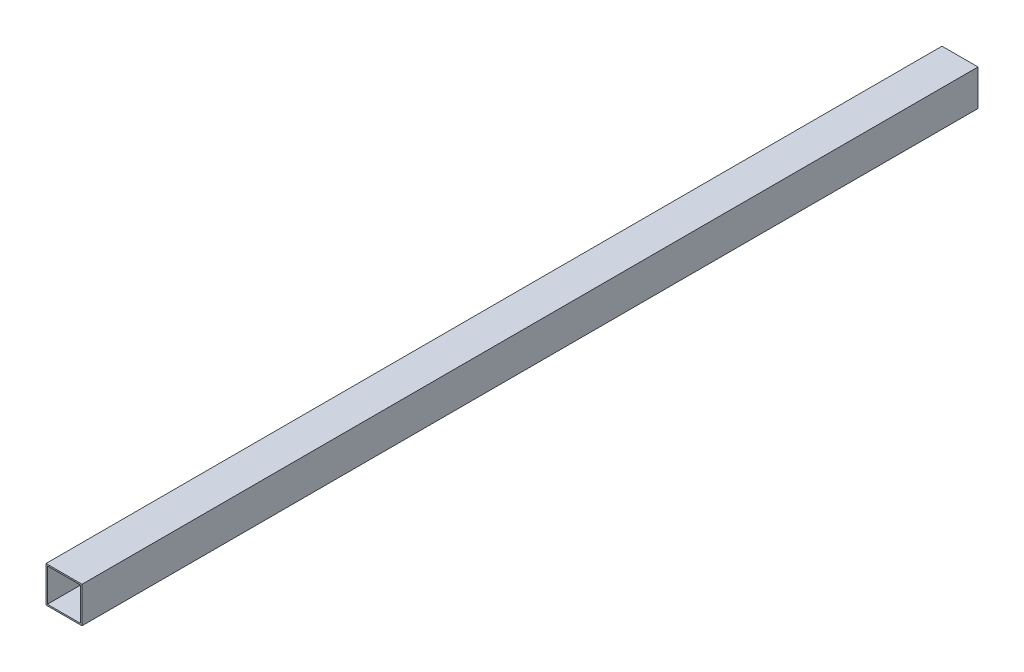
ISO-10303-21;
HEADER;
FILE_DESCRIPTION(('STEP AP214'),'2;1');
FILE_NAME('part.step','',(''),(''),'','','');
FILE_SCHEMA(('AUTOMOTIVE_DESIGN { 1 0 10303 214 1 1 1 1 }'));
ENDSEC;
DATA;
#1=APPLICATION_CONTEXT('core data for automotive mechanical design processes');
#2=APPLICATION_PROTOCOL_DEFINITION('international standard','automotive_design',2000,#1);
#3=PRODUCT_CONTEXT('',#1,'mechanical');
#4=PRODUCT('Part','Part','',(#3));
#5=PRODUCT_RELATED_PRODUCT_CATEGORY('part','',(#4));
#6=PRODUCT_DEFINITION_FORMATION('','',#4);
#7=PRODUCT_DEFINITION_CONTEXT('part definition',#1,'design');
#8=PRODUCT_DEFINITION('design','',#6,#7);
#9=PRODUCT_DEFINITION_SHAPE('','',#8);
#10=(LENGTH_UNIT() NAMED_UNIT(*) SI_UNIT(.MILLI.,.METRE.));
#11=(NAMED_UNIT(*) PLANE_ANGLE_UNIT() SI_UNIT($,.RADIAN.));
#12=(NAMED_UNIT(*) SI_UNIT($,.STERADIAN.) SOLID_ANGLE_UNIT());
#13=UNCERTAINTY_MEASURE_WITH_UNIT(LENGTH_MEASURE(1.E-05),#10,'distance_accuracy_value','');
#14=(GEOMETRIC_REPRESENTATION_CONTEXT(3) GLOBAL_UNCERTAINTY_ASSIGNED_CONTEXT((#13)) GLOBAL_UNIT_ASSIGNED_CONTEXT((#10,
#11,#12)) REPRESENTATION_CONTEXT('',''));
#15=CARTESIAN_POINT('',(0.,0.,0.));
#16=DIRECTION('',(0.,0.,1.));
#17=DIRECTION('',(1.,0.,0.));
#18=AXIS2_PLACEMENT_3D('',#15,#16,#17);
#19=CARTESIAN_POINT('',(0.,0.,323.5));
#20=DIRECTION('',(0.,0.,1.));
#21=DIRECTION('',(1.,0.,0.));
#22=AXIS2_PLACEMENT_3D('',#19,#20,#21);
#23=PLANE('',#22);
#24=DIRECTION('',(0.,1.,0.));
#25=VECTOR('',#24,1.);
#26=CARTESIAN_POINT('',(6.5,6.5,323.5));
#27=LINE('',#26,#25);
#28=CARTESIAN_POINT('',(6.5,-6.5,323.5));
#29=VERTEX_POINT('',#28);
#30=CARTESIAN_POINT('',(6.5,6.5,323.5));
#31=VERTEX_POINT('',#30);
#32=EDGE_CURVE('E133',#29,#31,#27,.T.);
#33=ORIENTED_EDGE('',*,*,#32,.T.);
#34=DIRECTION('',(-1.,0.,0.));
#35=VECTOR('',#34,1.);
#36=CARTESIAN_POINT('',(-6.5,6.5,323.5));
#37=LINE('',#36,#35);
#38=CARTESIAN_POINT('',(-6.5,6.5,323.5));
#39=VERTEX_POINT('',#38);
#40=EDGE_CURVE('E136',#31,#39,#37,.T.);
#41=ORIENTED_EDGE('',*,*,#40,.T.);
#42=DIRECTION('',(0.,-1.,0.));
#43=VECTOR('',#42,1.);
#44=CARTESIAN_POINT('',(-6.5,6.5,323.5));
#45=LINE('',#44,#43);
#46=CARTESIAN_POINT('',(-6.5,-6.5,323.5));
#47=VERTEX_POINT('',#46);
#48=EDGE_CURVE('E139',#39,#47,#45,.T.);
#49=ORIENTED_EDGE('',*,*,#48,.T.);
#50=DIRECTION('',(1.,0.,0.));
#51=VECTOR('',#50,1.);
#52=CARTESIAN_POINT('',(-6.5,-6.5,323.5));
#53=LINE('',#52,#51);
#54=EDGE_CURVE('E141',#47,#29,#53,.T.);
#55=ORIENTED_EDGE('',*,*,#54,.T.);
#56=EDGE_LOOP('',(#33,#41,#49,#55));
#57=FACE_BOUND('',#56,.T.);
#58=DIRECTION('',(1.,0.,0.));
#59=VECTOR('',#58,1.);
#60=CARTESIAN_POINT('',(6.,-6.,323.5));
#61=LINE('',#60,#59);
#62=CARTESIAN_POINT('',(-6.,-6.,323.5));
#63=VERTEX_POINT('',#62);
#64=CARTESIAN_POINT('',(6.,-6.,323.5));
#65=VERTEX_POINT('',#64);
#66=EDGE_CURVE('E105',#63,#65,#61,.T.);
#67=ORIENTED_EDGE('',*,*,#66,.F.);
#68=DIRECTION('',(0.,-1.,0.));
#69=VECTOR('',#68,1.);
#70=CARTESIAN_POINT('',(-6.,6.,323.5));
#71=LINE('',#70,#69);
#72=CARTESIAN_POINT('',(-6.,6.,323.5));
#73=VERTEX_POINT('',#72);
#74=EDGE_CURVE('E97',#73,#63,#71,.T.);
#75=ORIENTED_EDGE('',*,*,#74,.F.);
#76=DIRECTION('',(-1.,0.,0.));
#77=VECTOR('',#76,1.);
#78=CARTESIAN_POINT('',(6.,6.,323.5));
#79=LINE('',#78,#77);
#80=CARTESIAN_POINT('',(6.,6.,323.5));
#81=VERTEX_POINT('',#80);
#82=EDGE_CURVE('E119',#81,#73,#79,.T.);
#83=ORIENTED_EDGE('',*,*,#82,.F.);
#84=DIRECTION('',(0.,1.,0.));
#85=VECTOR('',#84,1.);
#86=CARTESIAN_POINT('',(6.,6.,323.5));
#87=LINE('',#86,#85);
#88=EDGE_CURVE('E117',#65,#81,#87,.T.);
#89=ORIENTED_EDGE('',*,*,#88,.F.);
#90=EDGE_LOOP('',(#67,#75,#83,#89));
#91=FACE_BOUND('',#90,.T.);
#92=ADVANCED_FACE('F32',(#57,#91),#23,.T.);
#93=CARTESIAN_POINT('',(0.,0.,0.));
#94=DIRECTION('',(0.,0.,1.));
#95=DIRECTION('',(1.,0.,0.));
#96=AXIS2_PLACEMENT_3D('',#93,#94,#95);
#97=PLANE('',#96);
#98=DIRECTION('',(0.,1.,0.));
#99=VECTOR('',#98,1.);
#100=CARTESIAN_POINT('',(6.5,6.5,0.));
#101=LINE('',#100,#99);
#102=CARTESIAN_POINT('',(6.5,-6.5,0.));
#103=VERTEX_POINT('',#102);
#104=CARTESIAN_POINT('',(6.5,6.5,0.));
#105=VERTEX_POINT('',#104);
#106=EDGE_CURVE('E113',#103,#105,#101,.T.);
#107=ORIENTED_EDGE('',*,*,#106,.F.);
#108=DIRECTION('',(1.,0.,0.));
#109=VECTOR('',#108,1.);
#110=CARTESIAN_POINT('',(-6.5,-6.5,0.));
#111=LINE('',#110,#109);
#112=CARTESIAN_POINT('',(-6.5,-6.5,0.));
#113=VERTEX_POINT('',#112);
#114=EDGE_CURVE('E137',#113,#103,#111,.T.);
#115=ORIENTED_EDGE('',*,*,#114,.F.);
#116=DIRECTION('',(0.,-1.,0.));
#117=VECTOR('',#116,1.);
#118=CARTESIAN_POINT('',(-6.5,6.5,0.));
#119=LINE('',#118,#117);
#120=CARTESIAN_POINT('',(-6.5,6.5,0.));
#121=VERTEX_POINT('',#120);
#122=EDGE_CURVE('E148',#121,#113,#119,.T.);
#123=ORIENTED_EDGE('',*,*,#122,.F.);
#124=DIRECTION('',(-1.,0.,0.));
#125=VECTOR('',#124,1.);
#126=CARTESIAN_POINT('',(-6.5,6.5,0.));
#127=LINE('',#126,#125);
#128=EDGE_CURVE('E146',#105,#121,#127,.T.);
#129=ORIENTED_EDGE('',*,*,#128,.F.);
#130=EDGE_LOOP('',(#107,#115,#123,#129));
#131=FACE_BOUND('',#130,.T.);
#132=DIRECTION('',(0.,-1.,0.));
#133=VECTOR('',#132,1.);
#134=CARTESIAN_POINT('',(-6.,6.,0.));
#135=LINE('',#134,#133);
#136=CARTESIAN_POINT('',(-6.,6.,0.));
#137=VERTEX_POINT('',#136);
#138=CARTESIAN_POINT('',(-6.,-6.,0.));
#139=VERTEX_POINT('',#138);
#140=EDGE_CURVE('E55',#137,#139,#135,.T.);
#141=ORIENTED_EDGE('',*,*,#140,.T.);
#142=DIRECTION('',(1.,0.,0.));
#143=VECTOR('',#142,1.);
#144=CARTESIAN_POINT('',(6.,-6.,0.));
#145=LINE('',#144,#143);
#146=CARTESIAN_POINT('',(6.,-6.,0.));
#147=VERTEX_POINT('',#146);
#148=EDGE_CURVE('E112',#139,#147,#145,.T.);
#149=ORIENTED_EDGE('',*,*,#148,.T.);
#150=DIRECTION('',(0.,1.,0.));
#151=VECTOR('',#150,1.);
#152=CARTESIAN_POINT('',(6.,6.,0.));
#153=LINE('',#152,#151);
#154=CARTESIAN_POINT('',(6.,6.,0.));
#155=VERTEX_POINT('',#154);
#156=EDGE_CURVE('E125',#147,#155,#153,.T.);
#157=ORIENTED_EDGE('',*,*,#156,.T.);
#158=DIRECTION('',(-1.,0.,0.));
#159=VECTOR('',#158,1.);
#160=CARTESIAN_POINT('',(6.,6.,0.));
#161=LINE('',#160,#159);
#162=EDGE_CURVE('E106',#155,#137,#161,.T.);
#163=ORIENTED_EDGE('',*,*,#162,.T.);
#164=EDGE_LOOP('',(#141,#149,#157,#163));
#165=FACE_BOUND('',#164,.T.);
#166=ADVANCED_FACE('F166',(#131,#165),#97,.F.);
#167=CARTESIAN_POINT('',(6.5,6.5,323.5));
#168=DIRECTION('',(-1.,0.,0.));
#169=DIRECTION('',(0.,0.,1.));
#170=AXIS2_PLACEMENT_3D('',#167,#168,#169);
#171=PLANE('',#170);
#172=ORIENTED_EDGE('',*,*,#106,.T.);
#173=DIRECTION('',(0.,0.,-1.));
#174=VECTOR('',#173,1.);
#175=CARTESIAN_POINT('',(6.5,6.5,323.5));
#176=LINE('',#175,#174);
#177=EDGE_CURVE('E11',#31,#105,#176,.T.);
#178=ORIENTED_EDGE('',*,*,#177,.F.);
#179=ORIENTED_EDGE('',*,*,#32,.F.);
#180=DIRECTION('',(0.,0.,-1.));
#181=VECTOR('',#180,1.);
#182=CARTESIAN_POINT('',(6.5,-6.5,323.5));
#183=LINE('',#182,#181);
#184=EDGE_CURVE('E143',#29,#103,#183,.T.);
#185=ORIENTED_EDGE('',*,*,#184,.T.);
#186=EDGE_LOOP('',(#172,#178,#179,#185));
#187=FACE_BOUND('',#186,.T.);
#188=ADVANCED_FACE('F34',(#187),#171,.F.);
#189=CARTESIAN_POINT('',(-6.5,6.5,323.5));
#190=DIRECTION('',(0.,-1.,0.));
#191=DIRECTION('',(0.,0.,-1.));
#192=AXIS2_PLACEMENT_3D('',#189,#190,#191);
#193=PLANE('',#192);
#194=ORIENTED_EDGE('',*,*,#128,.T.);
#195=DIRECTION('',(0.,0.,-1.));
#196=VECTOR('',#195,1.);
#197=CARTESIAN_POINT('',(-6.5,6.5,323.5));
#198=LINE('',#197,#196);
#199=EDGE_CURVE('E40',#39,#121,#198,.T.);
#200=ORIENTED_EDGE('',*,*,#199,.F.);
#201=ORIENTED_EDGE('',*,*,#40,.F.);
#202=ORIENTED_EDGE('',*,*,#177,.T.);
#203=EDGE_LOOP('',(#194,#200,#201,#202));
#204=FACE_BOUND('',#203,.T.);
#205=ADVANCED_FACE('F176',(#204),#193,.F.);
#206=CARTESIAN_POINT('',(-6.5,6.5,323.5));
#207=DIRECTION('',(1.,0.,0.));
#208=DIRECTION('',(0.,1.,0.));
#209=AXIS2_PLACEMENT_3D('',#206,#207,#208);
#210=PLANE('',#209);
#211=ORIENTED_EDGE('',*,*,#122,.T.);
#212=DIRECTION('',(0.,0.,-1.));
#213=VECTOR('',#212,1.);
#214=CARTESIAN_POINT('',(-6.5,-6.5,323.5));
#215=LINE('',#214,#213);
#216=EDGE_CURVE('E153',#47,#113,#215,.T.);
#217=ORIENTED_EDGE('',*,*,#216,.F.);
#218=ORIENTED_EDGE('',*,*,#48,.F.);
#219=ORIENTED_EDGE('',*,*,#199,.T.);
#220=EDGE_LOOP('',(#211,#217,#218,#219));
#221=FACE_BOUND('',#220,.T.);
#222=ADVANCED_FACE('F160',(#221),#210,.F.);
#223=CARTESIAN_POINT('',(-6.5,-6.5,323.5));
#224=DIRECTION('',(0.,1.,0.));
#225=DIRECTION('',(0.,0.,1.));
#226=AXIS2_PLACEMENT_3D('',#223,#224,#225);
#227=PLANE('',#226);
#228=ORIENTED_EDGE('',*,*,#114,.T.);
#229=ORIENTED_EDGE('',*,*,#184,.F.);
#230=ORIENTED_EDGE('',*,*,#54,.F.);
#231=ORIENTED_EDGE('',*,*,#216,.T.);
#232=EDGE_LOOP('',(#228,#229,#230,#231));
#233=FACE_BOUND('',#232,.T.);
#234=ADVANCED_FACE('F170',(#233),#227,.F.);
#235=CARTESIAN_POINT('',(-6.,6.,323.5));
#236=DIRECTION('',(1.,0.,0.));
#237=DIRECTION('',(0.,1.,0.));
#238=AXIS2_PLACEMENT_3D('',#235,#236,#237);
#239=PLANE('',#238);
#240=ORIENTED_EDGE('',*,*,#140,.F.);
#241=DIRECTION('',(0.,0.,-1.));
#242=VECTOR('',#241,1.);
#243=CARTESIAN_POINT('',(-6.,6.,323.5));
#244=LINE('',#243,#242);
#245=EDGE_CURVE('E101',#73,#137,#244,.T.);
#246=ORIENTED_EDGE('',*,*,#245,.F.);
#247=ORIENTED_EDGE('',*,*,#74,.T.);
#248=DIRECTION('',(0.,0.,-1.));
#249=VECTOR('',#248,1.);
#250=CARTESIAN_POINT('',(-6.,-6.,323.5));
#251=LINE('',#250,#249);
#252=EDGE_CURVE('E100',#63,#139,#251,.T.);
#253=ORIENTED_EDGE('',*,*,#252,.T.);
#254=EDGE_LOOP('',(#240,#246,#247,#253));
#255=FACE_BOUND('',#254,.T.);
#256=ADVANCED_FACE('F99',(#255),#239,.T.);
#257=CARTESIAN_POINT('',(6.,-6.,323.5));
#258=DIRECTION('',(0.,1.,0.));
#259=DIRECTION('',(-1.,0.,0.));
#260=AXIS2_PLACEMENT_3D('',#257,#258,#259);
#261=PLANE('',#260);
#262=ORIENTED_EDGE('',*,*,#148,.F.);
#263=ORIENTED_EDGE('',*,*,#252,.F.);
#264=ORIENTED_EDGE('',*,*,#66,.T.);
#265=DIRECTION('',(0.,0.,-1.));
#266=VECTOR('',#265,1.);
#267=CARTESIAN_POINT('',(6.,-6.,323.5));
#268=LINE('',#267,#266);
#269=EDGE_CURVE('E114',#65,#147,#268,.T.);
#270=ORIENTED_EDGE('',*,*,#269,.T.);
#271=EDGE_LOOP('',(#262,#263,#264,#270));
#272=FACE_BOUND('',#271,.T.);
#273=ADVANCED_FACE('F109',(#272),#261,.T.);
#274=CARTESIAN_POINT('',(6.,6.,323.5));
#275=DIRECTION('',(-1.,0.,0.));
#276=DIRECTION('',(0.,-1.,0.));
#277=AXIS2_PLACEMENT_3D('',#274,#275,#276);
#278=PLANE('',#277);
#279=ORIENTED_EDGE('',*,*,#156,.F.);
#280=ORIENTED_EDGE('',*,*,#269,.F.);
#281=ORIENTED_EDGE('',*,*,#88,.T.);
#282=DIRECTION('',(0.,0.,-1.));
#283=VECTOR('',#282,1.);
#284=CARTESIAN_POINT('',(6.,6.,323.5));
#285=LINE('',#284,#283);
#286=EDGE_CURVE('E47',#81,#155,#285,.T.);
#287=ORIENTED_EDGE('',*,*,#286,.T.);
#288=EDGE_LOOP('',(#279,#280,#281,#287));
#289=FACE_BOUND('',#288,.T.);
#290=ADVANCED_FACE('F199',(#289),#278,.T.);
#291=CARTESIAN_POINT('',(6.,6.,323.5));
#292=DIRECTION('',(0.,-1.,0.));
#293=DIRECTION('',(1.,0.,0.));
#294=AXIS2_PLACEMENT_3D('',#291,#292,#293);
#295=PLANE('',#294);
#296=ORIENTED_EDGE('',*,*,#162,.F.);
#297=ORIENTED_EDGE('',*,*,#286,.F.);
#298=ORIENTED_EDGE('',*,*,#82,.T.);
#299=ORIENTED_EDGE('',*,*,#245,.T.);
#300=EDGE_LOOP('',(#296,#297,#298,#299));
#301=FACE_BOUND('',#300,.T.);
#302=ADVANCED_FACE('F203',(#301),#295,.T.);
#303=CLOSED_SHELL('',(#92,#166,#188,#205,#222,#234,#256,#273,#290,#302));
#304=MANIFOLD_SOLID_BREP('B2',#303);
#305=ADVANCED_BREP_SHAPE_REPRESENTATION('',(#18,#304),#14);
#306=SHAPE_DEFINITION_REPRESENTATION(#9,#305);
ENDSEC;
END-ISO-10303-21;
